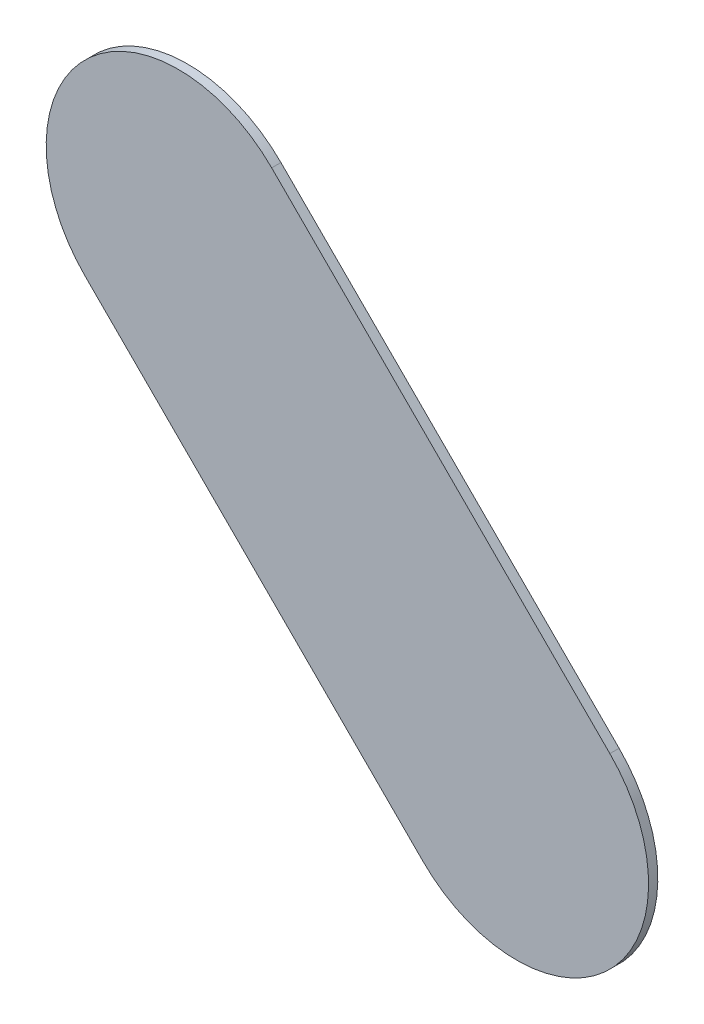
ISO-10303-21;
HEADER;
FILE_DESCRIPTION(('STEP AP214'),'2;1');
FILE_NAME('part.step','',(''),(''),'','','');
FILE_SCHEMA(('AUTOMOTIVE_DESIGN { 1 0 10303 214 1 1 1 1 }'));
ENDSEC;
DATA;
#1=APPLICATION_CONTEXT('core data for automotive mechanical design processes');
#2=APPLICATION_PROTOCOL_DEFINITION('international standard','automotive_design',2000,#1);
#3=PRODUCT_CONTEXT('',#1,'mechanical');
#4=PRODUCT('Part','Part','',(#3));
#5=PRODUCT_RELATED_PRODUCT_CATEGORY('part','',(#4));
#6=PRODUCT_DEFINITION_FORMATION('','',#4);
#7=PRODUCT_DEFINITION_CONTEXT('part definition',#1,'design');
#8=PRODUCT_DEFINITION('design','',#6,#7);
#9=PRODUCT_DEFINITION_SHAPE('','',#8);
#10=(LENGTH_UNIT() NAMED_UNIT(*) SI_UNIT(.MILLI.,.METRE.));
#11=(NAMED_UNIT(*) PLANE_ANGLE_UNIT() SI_UNIT($,.RADIAN.));
#12=(NAMED_UNIT(*) SI_UNIT($,.STERADIAN.) SOLID_ANGLE_UNIT());
#13=UNCERTAINTY_MEASURE_WITH_UNIT(LENGTH_MEASURE(1.E-05),#10,'distance_accuracy_value','');
#14=(GEOMETRIC_REPRESENTATION_CONTEXT(3) GLOBAL_UNCERTAINTY_ASSIGNED_CONTEXT((#13)) GLOBAL_UNIT_ASSIGNED_CONTEXT((#10,
#11,#12)) REPRESENTATION_CONTEXT('',''));
#15=CARTESIAN_POINT('',(0.,0.,0.));
#16=DIRECTION('',(0.,0.,1.));
#17=DIRECTION('',(1.,0.,0.));
#18=AXIS2_PLACEMENT_3D('',#15,#16,#17);
#19=CARTESIAN_POINT('',(125.693553,-94.406446,1.635));
#20=DIRECTION('',(0.,0.,1.));
#21=DIRECTION('',(1.,0.,0.));
#22=AXIS2_PLACEMENT_3D('',#19,#20,#21);
#23=PLANE('',#22);
#24=DIRECTION('',(-0.707106781186548,0.707106781186548,0.));
#25=VECTOR('',#24,1.);
#26=CARTESIAN_POINT('',(125.693553,-94.406446,1.635));
#27=LINE('',#26,#25);
#28=CARTESIAN_POINT('',(125.693553,-94.406446,1.635));
#29=VERTEX_POINT('',#28);
#30=CARTESIAN_POINT('',(124.413553,-93.126446,1.635));
#31=VERTEX_POINT('',#30);
#32=EDGE_CURVE('E83',#29,#31,#27,.T.);
#33=ORIENTED_EDGE('',*,*,#32,.T.);
#34=CARTESIAN_POINT('',(124.0599995,-93.4799995,1.635));
#35=DIRECTION('',(0.,0.,1.));
#36=DIRECTION('',(0.707106781186548,0.707106781186548,0.));
#37=AXIS2_PLACEMENT_3D('',#34,#35,#36);
#38=CIRCLE('',#37,0.500000154724);
#39=CARTESIAN_POINT('',(123.706446,-93.833553,1.635));
#40=VERTEX_POINT('',#39);
#41=EDGE_CURVE('E102',#31,#40,#38,.T.);
#42=ORIENTED_EDGE('',*,*,#41,.T.);
#43=DIRECTION('',(0.707106781186548,-0.707106781186548,0.));
#44=VECTOR('',#43,1.);
#45=CARTESIAN_POINT('',(123.706446,-93.833553,1.635));
#46=LINE('',#45,#44);
#47=CARTESIAN_POINT('',(124.986446,-95.113553,1.635));
#48=VERTEX_POINT('',#47);
#49=EDGE_CURVE('E75',#40,#48,#46,.T.);
#50=ORIENTED_EDGE('',*,*,#49,.T.);
#51=CARTESIAN_POINT('',(125.3399995,-94.7599995,1.635));
#52=DIRECTION('',(0.,0.,1.));
#53=DIRECTION('',(-0.707106781186548,-0.707106781186548,0.));
#54=AXIS2_PLACEMENT_3D('',#51,#52,#53);
#55=CIRCLE('',#54,0.500000154724);
#56=EDGE_CURVE('E11',#48,#29,#55,.T.);
#57=ORIENTED_EDGE('',*,*,#56,.T.);
#58=EDGE_LOOP('',(#33,#42,#50,#57));
#59=FACE_BOUND('',#58,.T.);
#60=ADVANCED_FACE('F17',(#59),#23,.T.);
#61=CARTESIAN_POINT('',(125.693553,-94.406446,1.6));
#62=DIRECTION('',(0.,0.,1.));
#63=DIRECTION('',(1.,0.,0.));
#64=AXIS2_PLACEMENT_3D('',#61,#62,#63);
#65=PLANE('',#64);
#66=CARTESIAN_POINT('',(125.3399995,-94.7599995,1.6));
#67=DIRECTION('',(0.,0.,1.));
#68=DIRECTION('',(-0.707106781186548,-0.707106781186548,0.));
#69=AXIS2_PLACEMENT_3D('',#66,#67,#68);
#70=CIRCLE('',#69,0.500000154724);
#71=CARTESIAN_POINT('',(124.986446,-95.113553,1.6));
#72=VERTEX_POINT('',#71);
#73=CARTESIAN_POINT('',(125.693553,-94.406446,1.6));
#74=VERTEX_POINT('',#73);
#75=EDGE_CURVE('E26',#72,#74,#70,.T.);
#76=ORIENTED_EDGE('',*,*,#75,.F.);
#77=DIRECTION('',(0.707106781186548,-0.707106781186548,0.));
#78=VECTOR('',#77,1.);
#79=CARTESIAN_POINT('',(123.706446,-93.833553,1.6));
#80=LINE('',#79,#78);
#81=CARTESIAN_POINT('',(123.706446,-93.833553,1.6));
#82=VERTEX_POINT('',#81);
#83=EDGE_CURVE('E111',#82,#72,#80,.T.);
#84=ORIENTED_EDGE('',*,*,#83,.F.);
#85=CARTESIAN_POINT('',(124.0599995,-93.4799995,1.6));
#86=DIRECTION('',(0.,0.,1.));
#87=DIRECTION('',(0.707106781186548,0.707106781186548,0.));
#88=AXIS2_PLACEMENT_3D('',#85,#86,#87);
#89=CIRCLE('',#88,0.500000154724);
#90=CARTESIAN_POINT('',(124.413553,-93.126446,1.6));
#91=VERTEX_POINT('',#90);
#92=EDGE_CURVE('E85',#91,#82,#89,.T.);
#93=ORIENTED_EDGE('',*,*,#92,.F.);
#94=DIRECTION('',(-0.707106781186548,0.707106781186548,0.));
#95=VECTOR('',#94,1.);
#96=CARTESIAN_POINT('',(125.693553,-94.406446,1.6));
#97=LINE('',#96,#95);
#98=EDGE_CURVE('E81',#74,#91,#97,.T.);
#99=ORIENTED_EDGE('',*,*,#98,.F.);
#100=EDGE_LOOP('',(#76,#84,#93,#99));
#101=FACE_BOUND('',#100,.T.);
#102=ADVANCED_FACE('F19',(#101),#65,.F.);
#103=CARTESIAN_POINT('',(125.3399995,-94.7599995,1.6));
#104=DIRECTION('',(0.,0.,-1.));
#105=DIRECTION('',(-0.707106781186548,-0.707106781186548,0.));
#106=AXIS2_PLACEMENT_3D('',#103,#104,#105);
#107=CYLINDRICAL_SURFACE('',#106,0.500000154724);
#108=ORIENTED_EDGE('',*,*,#75,.T.);
#109=DIRECTION('',(0.,0.,1.));
#110=VECTOR('',#109,1.);
#111=CARTESIAN_POINT('',(125.693553,-94.406446,1.6));
#112=LINE('',#111,#110);
#113=EDGE_CURVE('E69',#74,#29,#112,.T.);
#114=ORIENTED_EDGE('',*,*,#113,.T.);
#115=ORIENTED_EDGE('',*,*,#56,.F.);
#116=DIRECTION('',(0.,0.,1.));
#117=VECTOR('',#116,1.);
#118=CARTESIAN_POINT('',(124.986446,-95.113553,1.6));
#119=LINE('',#118,#117);
#120=EDGE_CURVE('E72',#72,#48,#119,.T.);
#121=ORIENTED_EDGE('',*,*,#120,.F.);
#122=EDGE_LOOP('',(#108,#114,#115,#121));
#123=FACE_BOUND('',#122,.T.);
#124=ADVANCED_FACE('F68',(#123),#107,.T.);
#125=CARTESIAN_POINT('',(123.706446,-93.833553,1.6));
#126=DIRECTION('',(0.707106781186548,0.707106781186548,0.));
#127=DIRECTION('',(0.,0.,-1.));
#128=AXIS2_PLACEMENT_3D('',#125,#126,#127);
#129=PLANE('',#128);
#130=ORIENTED_EDGE('',*,*,#83,.T.);
#131=ORIENTED_EDGE('',*,*,#120,.T.);
#132=ORIENTED_EDGE('',*,*,#49,.F.);
#133=DIRECTION('',(0.,0.,1.));
#134=VECTOR('',#133,1.);
#135=CARTESIAN_POINT('',(123.706446,-93.833553,1.6));
#136=LINE('',#135,#134);
#137=EDGE_CURVE('E99',#82,#40,#136,.T.);
#138=ORIENTED_EDGE('',*,*,#137,.F.);
#139=EDGE_LOOP('',(#130,#131,#132,#138));
#140=FACE_BOUND('',#139,.T.);
#141=ADVANCED_FACE('F121',(#140),#129,.F.);
#142=CARTESIAN_POINT('',(124.0599995,-93.4799995,1.6));
#143=DIRECTION('',(0.,0.,-1.));
#144=DIRECTION('',(0.707106781186548,0.707106781186548,0.));
#145=AXIS2_PLACEMENT_3D('',#142,#143,#144);
#146=CYLINDRICAL_SURFACE('',#145,0.500000154724);
#147=ORIENTED_EDGE('',*,*,#92,.T.);
#148=ORIENTED_EDGE('',*,*,#137,.T.);
#149=ORIENTED_EDGE('',*,*,#41,.F.);
#150=DIRECTION('',(0.,0.,1.));
#151=VECTOR('',#150,1.);
#152=CARTESIAN_POINT('',(124.413553,-93.126446,1.6));
#153=LINE('',#152,#151);
#154=EDGE_CURVE('E90',#91,#31,#153,.T.);
#155=ORIENTED_EDGE('',*,*,#154,.F.);
#156=EDGE_LOOP('',(#147,#148,#149,#155));
#157=FACE_BOUND('',#156,.T.);
#158=ADVANCED_FACE('F124',(#157),#146,.T.);
#159=CARTESIAN_POINT('',(125.693553,-94.406446,1.6));
#160=DIRECTION('',(-0.707106781186548,-0.707106781186548,0.));
#161=DIRECTION('',(-0.707106781186548,0.707106781186548,0.));
#162=AXIS2_PLACEMENT_3D('',#159,#160,#161);
#163=PLANE('',#162);
#164=ORIENTED_EDGE('',*,*,#98,.T.);
#165=ORIENTED_EDGE('',*,*,#154,.T.);
#166=ORIENTED_EDGE('',*,*,#32,.F.);
#167=ORIENTED_EDGE('',*,*,#113,.F.);
#168=EDGE_LOOP('',(#164,#165,#166,#167));
#169=FACE_BOUND('',#168,.T.);
#170=ADVANCED_FACE('F79',(#169),#163,.F.);
#171=CLOSED_SHELL('',(#60,#102,#124,#141,#158,#170));
#172=MANIFOLD_SOLID_BREP('B1',#171);
#173=ADVANCED_BREP_SHAPE_REPRESENTATION('',(#18,#172),#14);
#174=SHAPE_DEFINITION_REPRESENTATION(#9,#173);
ENDSEC;
END-ISO-10303-21;
